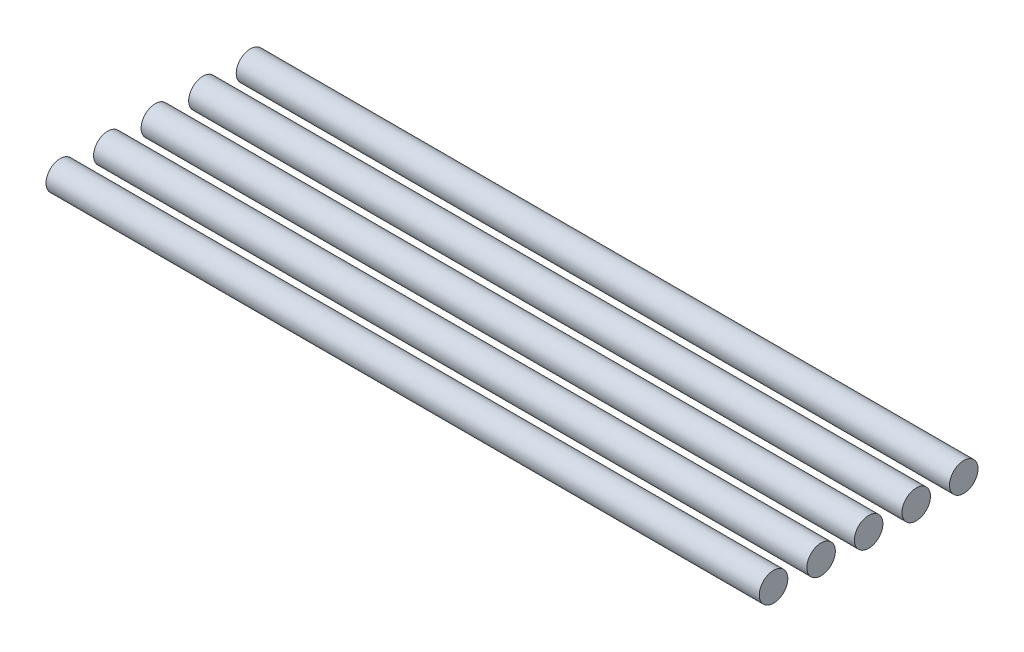
ISO-10303-21;
HEADER;
FILE_DESCRIPTION(('STEP AP214'),'2;1');
FILE_NAME('part.step','',(''),(''),'','','');
FILE_SCHEMA(('AUTOMOTIVE_DESIGN { 1 0 10303 214 1 1 1 1 }'));
ENDSEC;
DATA;
#1=APPLICATION_CONTEXT('core data for automotive mechanical design processes');
#2=APPLICATION_PROTOCOL_DEFINITION('international standard','automotive_design',2000,#1);
#3=PRODUCT_CONTEXT('',#1,'mechanical');
#4=PRODUCT('Part','Part','',(#3));
#5=PRODUCT_RELATED_PRODUCT_CATEGORY('part','',(#4));
#6=PRODUCT_DEFINITION_FORMATION('','',#4);
#7=PRODUCT_DEFINITION_CONTEXT('part definition',#1,'design');
#8=PRODUCT_DEFINITION('design','',#6,#7);
#9=PRODUCT_DEFINITION_SHAPE('','',#8);
#10=(LENGTH_UNIT() NAMED_UNIT(*) SI_UNIT(.MILLI.,.METRE.));
#11=(NAMED_UNIT(*) PLANE_ANGLE_UNIT() SI_UNIT($,.RADIAN.));
#12=(NAMED_UNIT(*) SI_UNIT($,.STERADIAN.) SOLID_ANGLE_UNIT());
#13=UNCERTAINTY_MEASURE_WITH_UNIT(LENGTH_MEASURE(1.E-05),#10,'distance_accuracy_value','');
#14=(GEOMETRIC_REPRESENTATION_CONTEXT(3) GLOBAL_UNCERTAINTY_ASSIGNED_CONTEXT((#13)) GLOBAL_UNIT_ASSIGNED_CONTEXT((#10,
#11,#12)) REPRESENTATION_CONTEXT('',''));
#15=CARTESIAN_POINT('',(0.,0.,0.));
#16=DIRECTION('',(0.,0.,1.));
#17=DIRECTION('',(1.,0.,0.));
#18=AXIS2_PLACEMENT_3D('',#15,#16,#17);
#19=CARTESIAN_POINT('',(19.05,0.,-5.08));
#20=DIRECTION('',(-1.,0.,0.));
#21=DIRECTION('',(0.,0.,1.));
#22=AXIS2_PLACEMENT_3D('',#19,#20,#21);
#23=CYLINDRICAL_SURFACE('',#22,0.761999999999999);
#24=CARTESIAN_POINT('',(19.05,0.,-5.08));
#25=DIRECTION('',(1.,0.,0.));
#26=DIRECTION('',(0.,0.,-1.));
#27=AXIS2_PLACEMENT_3D('',#24,#25,#26);
#28=CIRCLE('',#27,0.761999999999999);
#29=CARTESIAN_POINT('',(19.05,0.,-4.318));
#30=VERTEX_POINT('',#29);
#31=EDGE_CURVE('E11',#30,#30,#28,.T.);
#32=CARTESIAN_POINT('',(-19.05,0.,-5.08));
#33=DIRECTION('',(1.,0.,0.));
#34=DIRECTION('',(0.,0.,-1.));
#35=AXIS2_PLACEMENT_3D('',#32,#33,#34);
#36=CIRCLE('',#35,0.761999999999999);
#37=CARTESIAN_POINT('',(-19.05,0.,-4.318));
#38=VERTEX_POINT('',#37);
#39=EDGE_CURVE('E45',#38,#38,#36,.T.);
#40=CARTESIAN_POINT('',(19.05,0.,-4.318));
#41=CARTESIAN_POINT('',(18.653125,0.,-4.318));
#42=CARTESIAN_POINT('',(18.25625,0.,-4.318));
#43=CARTESIAN_POINT('',(17.4625,0.,-4.318));
#44=CARTESIAN_POINT('',(17.065625,0.,-4.318));
#45=CARTESIAN_POINT('',(16.271875,0.,-4.318));
#46=CARTESIAN_POINT('',(15.875,0.,-4.318));
#47=CARTESIAN_POINT('',(15.08125,0.,-4.318));
#48=CARTESIAN_POINT('',(14.684375,0.,-4.318));
#49=CARTESIAN_POINT('',(13.890625,0.,-4.318));
#50=CARTESIAN_POINT('',(13.49375,0.,-4.318));
#51=CARTESIAN_POINT('',(12.7,0.,-4.318));
#52=CARTESIAN_POINT('',(12.303125,0.,-4.318));
#53=CARTESIAN_POINT('',(11.509375,0.,-4.318));
#54=CARTESIAN_POINT('',(11.1125,0.,-4.318));
#55=CARTESIAN_POINT('',(10.31875,0.,-4.318));
#56=CARTESIAN_POINT('',(9.921875,0.,-4.318));
#57=CARTESIAN_POINT('',(9.128125,0.,-4.318));
#58=CARTESIAN_POINT('',(8.73125,0.,-4.318));
#59=CARTESIAN_POINT('',(7.9375,0.,-4.318));
#60=CARTESIAN_POINT('',(7.540625,0.,-4.318));
#61=CARTESIAN_POINT('',(6.746875,0.,-4.318));
#62=CARTESIAN_POINT('',(6.35,0.,-4.318));
#63=CARTESIAN_POINT('',(5.55625,0.,-4.318));
#64=CARTESIAN_POINT('',(5.159375,0.,-4.318));
#65=CARTESIAN_POINT('',(4.365625,0.,-4.318));
#66=CARTESIAN_POINT('',(3.96875,0.,-4.318));
#67=CARTESIAN_POINT('',(3.175,0.,-4.318));
#68=CARTESIAN_POINT('',(2.778125,0.,-4.318));
#69=CARTESIAN_POINT('',(1.984375,0.,-4.318));
#70=CARTESIAN_POINT('',(1.5875,0.,-4.318));
#71=CARTESIAN_POINT('',(0.79375,0.,-4.318));
#72=CARTESIAN_POINT('',(0.396875,0.,-4.318));
#73=CARTESIAN_POINT('',(-0.396875,0.,-4.318));
#74=CARTESIAN_POINT('',(-0.79375,0.,-4.318));
#75=CARTESIAN_POINT('',(-1.5875,0.,-4.318));
#76=CARTESIAN_POINT('',(-1.984375,0.,-4.318));
#77=CARTESIAN_POINT('',(-2.778125,0.,-4.318));
#78=CARTESIAN_POINT('',(-3.175,0.,-4.318));
#79=CARTESIAN_POINT('',(-3.96875,0.,-4.318));
#80=CARTESIAN_POINT('',(-4.365625,0.,-4.318));
#81=CARTESIAN_POINT('',(-5.159375,0.,-4.318));
#82=CARTESIAN_POINT('',(-5.55625,0.,-4.318));
#83=CARTESIAN_POINT('',(-6.35,0.,-4.318));
#84=CARTESIAN_POINT('',(-6.746875,0.,-4.318));
#85=CARTESIAN_POINT('',(-7.540625,0.,-4.318));
#86=CARTESIAN_POINT('',(-7.9375,0.,-4.318));
#87=CARTESIAN_POINT('',(-8.73125,0.,-4.318));
#88=CARTESIAN_POINT('',(-9.128125,0.,-4.318));
#89=CARTESIAN_POINT('',(-9.921875,0.,-4.318));
#90=CARTESIAN_POINT('',(-10.31875,0.,-4.318));
#91=CARTESIAN_POINT('',(-11.1125,0.,-4.318));
#92=CARTESIAN_POINT('',(-11.509375,0.,-4.318));
#93=CARTESIAN_POINT('',(-12.303125,0.,-4.318));
#94=CARTESIAN_POINT('',(-12.7,0.,-4.318));
#95=CARTESIAN_POINT('',(-13.49375,0.,-4.318));
#96=CARTESIAN_POINT('',(-13.890625,0.,-4.318));
#97=CARTESIAN_POINT('',(-14.684375,0.,-4.318));
#98=CARTESIAN_POINT('',(-15.08125,0.,-4.318));
#99=CARTESIAN_POINT('',(-15.875,0.,-4.318));
#100=CARTESIAN_POINT('',(-16.271875,0.,-4.318));
#101=CARTESIAN_POINT('',(-17.065625,0.,-4.318));
#102=CARTESIAN_POINT('',(-17.4625,0.,-4.318));
#103=CARTESIAN_POINT('',(-18.25625,0.,-4.318));
#104=CARTESIAN_POINT('',(-18.653125,0.,-4.318));
#105=CARTESIAN_POINT('',(-19.05,0.,-4.318));
#106=B_SPLINE_CURVE_WITH_KNOTS('',3,(#40,#41,#42,#43,#44,#45,#46,#47,#48,#49,#50,#51,#52,#53,
#54,#55,#56,#57,#58,#59,#60,#61,#62,#63,#64,#65,#66,#67,#68,#69,#70,#71,#72,#73,#74,#75,#76,#77,
#78,#79,#80,#81,#82,#83,#84,#85,#86,#87,#88,#89,#90,#91,#92,#93,#94,#95,#96,#97,#98,#99,#100,
#101,#102,#103,#104,#105),.UNSPECIFIED.,.F.,.F.,(4,2,2,2,2,2,2,2,2,2,2,2,2,2,2,2,2,2,2,2,2,2,2,
2,2,2,2,2,2,2,2,2,4),(0.,1.190625,2.38125,3.571875,4.7625,5.953125,7.14375,8.334375,9.525,
10.715625,11.90625,13.096875,14.2875,15.478125,16.66875,17.859375,19.05,20.240625,21.43125,
22.621875,23.8125,25.003125,26.19375,27.384375,28.575,29.765625,30.95625,32.146875,33.3375,
34.528125,35.71875,36.909375,38.1),.UNSPECIFIED.);
#107=EDGE_CURVE('BSEAM42',#30,#38,#106,.T.);
#108=ORIENTED_EDGE('',*,*,#31,.F.);
#109=ORIENTED_EDGE('',*,*,#39,.T.);
#110=ORIENTED_EDGE('',*,*,#107,.T.);
#111=ORIENTED_EDGE('',*,*,#107,.F.);
#112=EDGE_LOOP('',(#108,#110,#109,#111));
#113=FACE_BOUND('',#112,.T.);
#114=ADVANCED_FACE('F42',(#113),#23,.T.);
#115=CARTESIAN_POINT('',(19.05,0.,-5.08));
#116=DIRECTION('',(1.,0.,0.));
#117=DIRECTION('',(0.,0.,-1.));
#118=AXIS2_PLACEMENT_3D('',#115,#116,#117);
#119=PLANE('',#118);
#120=ORIENTED_EDGE('',*,*,#31,.T.);
#121=EDGE_LOOP('',(#120));
#122=FACE_BOUND('',#121,.T.);
#123=ADVANCED_FACE('F57',(#122),#119,.T.);
#124=CARTESIAN_POINT('',(-19.05,0.,-5.08));
#125=DIRECTION('',(1.,0.,0.));
#126=DIRECTION('',(0.,0.,-1.));
#127=AXIS2_PLACEMENT_3D('',#124,#125,#126);
#128=PLANE('',#127);
#129=ORIENTED_EDGE('',*,*,#39,.F.);
#130=EDGE_LOOP('',(#129));
#131=FACE_BOUND('',#130,.T.);
#132=ADVANCED_FACE('F55',(#131),#128,.F.);
#133=CLOSED_SHELL('',(#114,#123,#132));
#134=MANIFOLD_SOLID_BREP('B2',#133);
#135=CARTESIAN_POINT('',(19.05,0.,-2.54));
#136=DIRECTION('',(-1.,0.,0.));
#137=DIRECTION('',(0.,0.,1.));
#138=AXIS2_PLACEMENT_3D('',#135,#136,#137);
#139=CYLINDRICAL_SURFACE('',#138,0.762);
#140=CARTESIAN_POINT('',(19.05,0.,-2.54));
#141=DIRECTION('',(1.,0.,0.));
#142=DIRECTION('',(0.,0.,-1.));
#143=AXIS2_PLACEMENT_3D('',#140,#141,#142);
#144=CIRCLE('',#143,0.762);
#145=CARTESIAN_POINT('',(19.05,0.,-1.778));
#146=VERTEX_POINT('',#145);
#147=EDGE_CURVE('E41',#146,#146,#144,.T.);
#148=CARTESIAN_POINT('',(-19.05,0.,-2.54));
#149=DIRECTION('',(1.,0.,0.));
#150=DIRECTION('',(0.,0.,-1.));
#151=AXIS2_PLACEMENT_3D('',#148,#149,#150);
#152=CIRCLE('',#151,0.762);
#153=CARTESIAN_POINT('',(-19.05,0.,-1.778));
#154=VERTEX_POINT('',#153);
#155=EDGE_CURVE('E94',#154,#154,#152,.T.);
#156=CARTESIAN_POINT('',(19.05,0.,-1.778));
#157=CARTESIAN_POINT('',(18.653125,0.,-1.778));
#158=CARTESIAN_POINT('',(18.25625,0.,-1.778));
#159=CARTESIAN_POINT('',(17.4625,0.,-1.778));
#160=CARTESIAN_POINT('',(17.065625,0.,-1.778));
#161=CARTESIAN_POINT('',(16.271875,0.,-1.778));
#162=CARTESIAN_POINT('',(15.875,0.,-1.778));
#163=CARTESIAN_POINT('',(15.08125,0.,-1.778));
#164=CARTESIAN_POINT('',(14.684375,0.,-1.778));
#165=CARTESIAN_POINT('',(13.890625,0.,-1.778));
#166=CARTESIAN_POINT('',(13.49375,0.,-1.778));
#167=CARTESIAN_POINT('',(12.7,0.,-1.778));
#168=CARTESIAN_POINT('',(12.303125,0.,-1.778));
#169=CARTESIAN_POINT('',(11.509375,0.,-1.778));
#170=CARTESIAN_POINT('',(11.1125,0.,-1.778));
#171=CARTESIAN_POINT('',(10.31875,0.,-1.778));
#172=CARTESIAN_POINT('',(9.921875,0.,-1.778));
#173=CARTESIAN_POINT('',(9.128125,0.,-1.778));
#174=CARTESIAN_POINT('',(8.73125,0.,-1.778));
#175=CARTESIAN_POINT('',(7.9375,0.,-1.778));
#176=CARTESIAN_POINT('',(7.540625,0.,-1.778));
#177=CARTESIAN_POINT('',(6.746875,0.,-1.778));
#178=CARTESIAN_POINT('',(6.35,0.,-1.778));
#179=CARTESIAN_POINT('',(5.55625,0.,-1.778));
#180=CARTESIAN_POINT('',(5.159375,0.,-1.778));
#181=CARTESIAN_POINT('',(4.365625,0.,-1.778));
#182=CARTESIAN_POINT('',(3.96875,0.,-1.778));
#183=CARTESIAN_POINT('',(3.175,0.,-1.778));
#184=CARTESIAN_POINT('',(2.778125,0.,-1.778));
#185=CARTESIAN_POINT('',(1.984375,0.,-1.778));
#186=CARTESIAN_POINT('',(1.5875,0.,-1.778));
#187=CARTESIAN_POINT('',(0.79375,0.,-1.778));
#188=CARTESIAN_POINT('',(0.396875,0.,-1.778));
#189=CARTESIAN_POINT('',(-0.396875,0.,-1.778));
#190=CARTESIAN_POINT('',(-0.79375,0.,-1.778));
#191=CARTESIAN_POINT('',(-1.5875,0.,-1.778));
#192=CARTESIAN_POINT('',(-1.984375,0.,-1.778));
#193=CARTESIAN_POINT('',(-2.778125,0.,-1.778));
#194=CARTESIAN_POINT('',(-3.175,0.,-1.778));
#195=CARTESIAN_POINT('',(-3.96875,0.,-1.778));
#196=CARTESIAN_POINT('',(-4.365625,0.,-1.778));
#197=CARTESIAN_POINT('',(-5.159375,0.,-1.778));
#198=CARTESIAN_POINT('',(-5.55625,0.,-1.778));
#199=CARTESIAN_POINT('',(-6.35,0.,-1.778));
#200=CARTESIAN_POINT('',(-6.746875,0.,-1.778));
#201=CARTESIAN_POINT('',(-7.540625,0.,-1.778));
#202=CARTESIAN_POINT('',(-7.9375,0.,-1.778));
#203=CARTESIAN_POINT('',(-8.73125,0.,-1.778));
#204=CARTESIAN_POINT('',(-9.128125,0.,-1.778));
#205=CARTESIAN_POINT('',(-9.921875,0.,-1.778));
#206=CARTESIAN_POINT('',(-10.31875,0.,-1.778));
#207=CARTESIAN_POINT('',(-11.1125,0.,-1.778));
#208=CARTESIAN_POINT('',(-11.509375,0.,-1.778));
#209=CARTESIAN_POINT('',(-12.303125,0.,-1.778));
#210=CARTESIAN_POINT('',(-12.7,0.,-1.778));
#211=CARTESIAN_POINT('',(-13.49375,0.,-1.778));
#212=CARTESIAN_POINT('',(-13.890625,0.,-1.778));
#213=CARTESIAN_POINT('',(-14.684375,0.,-1.778));
#214=CARTESIAN_POINT('',(-15.08125,0.,-1.778));
#215=CARTESIAN_POINT('',(-15.875,0.,-1.778));
#216=CARTESIAN_POINT('',(-16.271875,0.,-1.778));
#217=CARTESIAN_POINT('',(-17.065625,0.,-1.778));
#218=CARTESIAN_POINT('',(-17.4625,0.,-1.778));
#219=CARTESIAN_POINT('',(-18.25625,0.,-1.778));
#220=CARTESIAN_POINT('',(-18.653125,0.,-1.778));
#221=CARTESIAN_POINT('',(-19.05,0.,-1.778));
#222=B_SPLINE_CURVE_WITH_KNOTS('',3,(#156,#157,#158,#159,#160,#161,#162,#163,#164,#165,#166,
#167,#168,#169,#170,#171,#172,#173,#174,#175,#176,#177,#178,#179,#180,#181,#182,#183,#184,#185,
#186,#187,#188,#189,#190,#191,#192,#193,#194,#195,#196,#197,#198,#199,#200,#201,#202,#203,#204,
#205,#206,#207,#208,#209,#210,#211,#212,#213,#214,#215,#216,#217,#218,#219,#220,#221),
.UNSPECIFIED.,.F.,.F.,(4,2,2,2,2,2,2,2,2,2,2,2,2,2,2,2,2,2,2,2,2,2,2,2,2,2,2,2,2,2,2,2,4),(0.,
1.190625,2.38125,3.571875,4.7625,5.953125,7.14375,8.334375,9.525,10.715625,11.90625,13.096875,
14.2875,15.478125,16.66875,17.859375,19.05,20.240625,21.43125,22.621875,23.8125,25.003125,
26.19375,27.384375,28.575,29.765625,30.95625,32.146875,33.3375,34.528125,35.71875,36.909375,
38.1),.UNSPECIFIED.);
#223=EDGE_CURVE('BSEAM91',#146,#154,#222,.T.);
#224=ORIENTED_EDGE('',*,*,#147,.F.);
#225=ORIENTED_EDGE('',*,*,#155,.T.);
#226=ORIENTED_EDGE('',*,*,#223,.T.);
#227=ORIENTED_EDGE('',*,*,#223,.F.);
#228=EDGE_LOOP('',(#224,#226,#225,#227));
#229=FACE_BOUND('',#228,.T.);
#230=ADVANCED_FACE('F91',(#229),#139,.T.);
#231=CARTESIAN_POINT('',(19.05,0.,-2.54));
#232=DIRECTION('',(1.,0.,0.));
#233=DIRECTION('',(0.,0.,-1.));
#234=AXIS2_PLACEMENT_3D('',#231,#232,#233);
#235=PLANE('',#234);
#236=ORIENTED_EDGE('',*,*,#147,.T.);
#237=EDGE_LOOP('',(#236));
#238=FACE_BOUND('',#237,.T.);
#239=ADVANCED_FACE('F106',(#238),#235,.T.);
#240=CARTESIAN_POINT('',(-19.05,0.,-2.54));
#241=DIRECTION('',(1.,0.,0.));
#242=DIRECTION('',(0.,0.,-1.));
#243=AXIS2_PLACEMENT_3D('',#240,#241,#242);
#244=PLANE('',#243);
#245=ORIENTED_EDGE('',*,*,#155,.F.);
#246=EDGE_LOOP('',(#245));
#247=FACE_BOUND('',#246,.T.);
#248=ADVANCED_FACE('F104',(#247),#244,.F.);
#249=CLOSED_SHELL('',(#230,#239,#248));
#250=MANIFOLD_SOLID_BREP('B6',#249);
#251=CARTESIAN_POINT('',(19.05,0.,2.54));
#252=DIRECTION('',(-1.,0.,0.));
#253=DIRECTION('',(0.,0.,1.));
#254=AXIS2_PLACEMENT_3D('',#251,#252,#253);
#255=CYLINDRICAL_SURFACE('',#254,0.762);
#256=CARTESIAN_POINT('',(19.05,0.,2.54));
#257=DIRECTION('',(1.,0.,0.));
#258=DIRECTION('',(0.,0.,-1.));
#259=AXIS2_PLACEMENT_3D('',#256,#257,#258);
#260=CIRCLE('',#259,0.762);
#261=CARTESIAN_POINT('',(19.05,0.,3.302));
#262=VERTEX_POINT('',#261);
#263=EDGE_CURVE('E90',#262,#262,#260,.T.);
#264=CARTESIAN_POINT('',(-19.05,0.,2.54));
#265=DIRECTION('',(1.,0.,0.));
#266=DIRECTION('',(0.,0.,-1.));
#267=AXIS2_PLACEMENT_3D('',#264,#265,#266);
#268=CIRCLE('',#267,0.762);
#269=CARTESIAN_POINT('',(-19.05,0.,3.302));
#270=VERTEX_POINT('',#269);
#271=EDGE_CURVE('E143',#270,#270,#268,.T.);
#272=CARTESIAN_POINT('',(19.05,0.,3.302));
#273=CARTESIAN_POINT('',(18.653125,0.,3.302));
#274=CARTESIAN_POINT('',(18.25625,0.,3.302));
#275=CARTESIAN_POINT('',(17.4625,0.,3.302));
#276=CARTESIAN_POINT('',(17.065625,0.,3.302));
#277=CARTESIAN_POINT('',(16.271875,0.,3.302));
#278=CARTESIAN_POINT('',(15.875,0.,3.302));
#279=CARTESIAN_POINT('',(15.08125,0.,3.302));
#280=CARTESIAN_POINT('',(14.684375,0.,3.302));
#281=CARTESIAN_POINT('',(13.890625,0.,3.302));
#282=CARTESIAN_POINT('',(13.49375,0.,3.302));
#283=CARTESIAN_POINT('',(12.7,0.,3.302));
#284=CARTESIAN_POINT('',(12.303125,0.,3.302));
#285=CARTESIAN_POINT('',(11.509375,0.,3.302));
#286=CARTESIAN_POINT('',(11.1125,0.,3.302));
#287=CARTESIAN_POINT('',(10.31875,0.,3.302));
#288=CARTESIAN_POINT('',(9.921875,0.,3.302));
#289=CARTESIAN_POINT('',(9.128125,0.,3.302));
#290=CARTESIAN_POINT('',(8.73125,0.,3.302));
#291=CARTESIAN_POINT('',(7.9375,0.,3.302));
#292=CARTESIAN_POINT('',(7.540625,0.,3.302));
#293=CARTESIAN_POINT('',(6.746875,0.,3.302));
#294=CARTESIAN_POINT('',(6.35,0.,3.302));
#295=CARTESIAN_POINT('',(5.55625,0.,3.302));
#296=CARTESIAN_POINT('',(5.159375,0.,3.302));
#297=CARTESIAN_POINT('',(4.365625,0.,3.302));
#298=CARTESIAN_POINT('',(3.96875,0.,3.302));
#299=CARTESIAN_POINT('',(3.175,0.,3.302));
#300=CARTESIAN_POINT('',(2.778125,0.,3.302));
#301=CARTESIAN_POINT('',(1.984375,0.,3.302));
#302=CARTESIAN_POINT('',(1.5875,0.,3.302));
#303=CARTESIAN_POINT('',(0.79375,0.,3.302));
#304=CARTESIAN_POINT('',(0.396875,0.,3.302));
#305=CARTESIAN_POINT('',(-0.396875,0.,3.302));
#306=CARTESIAN_POINT('',(-0.79375,0.,3.302));
#307=CARTESIAN_POINT('',(-1.5875,0.,3.302));
#308=CARTESIAN_POINT('',(-1.984375,0.,3.302));
#309=CARTESIAN_POINT('',(-2.778125,0.,3.302));
#310=CARTESIAN_POINT('',(-3.175,0.,3.302));
#311=CARTESIAN_POINT('',(-3.96875,0.,3.302));
#312=CARTESIAN_POINT('',(-4.365625,0.,3.302));
#313=CARTESIAN_POINT('',(-5.159375,0.,3.302));
#314=CARTESIAN_POINT('',(-5.55625,0.,3.302));
#315=CARTESIAN_POINT('',(-6.35,0.,3.302));
#316=CARTESIAN_POINT('',(-6.746875,0.,3.302));
#317=CARTESIAN_POINT('',(-7.540625,0.,3.302));
#318=CARTESIAN_POINT('',(-7.9375,0.,3.302));
#319=CARTESIAN_POINT('',(-8.73125,0.,3.302));
#320=CARTESIAN_POINT('',(-9.128125,0.,3.302));
#321=CARTESIAN_POINT('',(-9.921875,0.,3.302));
#322=CARTESIAN_POINT('',(-10.31875,0.,3.302));
#323=CARTESIAN_POINT('',(-11.1125,0.,3.302));
#324=CARTESIAN_POINT('',(-11.509375,0.,3.302));
#325=CARTESIAN_POINT('',(-12.303125,0.,3.302));
#326=CARTESIAN_POINT('',(-12.7,0.,3.302));
#327=CARTESIAN_POINT('',(-13.49375,0.,3.302));
#328=CARTESIAN_POINT('',(-13.890625,0.,3.302));
#329=CARTESIAN_POINT('',(-14.684375,0.,3.302));
#330=CARTESIAN_POINT('',(-15.08125,0.,3.302));
#331=CARTESIAN_POINT('',(-15.875,0.,3.302));
#332=CARTESIAN_POINT('',(-16.271875,0.,3.302));
#333=CARTESIAN_POINT('',(-17.065625,0.,3.302));
#334=CARTESIAN_POINT('',(-17.4625,0.,3.302));
#335=CARTESIAN_POINT('',(-18.25625,0.,3.302));
#336=CARTESIAN_POINT('',(-18.653125,0.,3.302));
#337=CARTESIAN_POINT('',(-19.05,0.,3.302));
#338=B_SPLINE_CURVE_WITH_KNOTS('',3,(#272,#273,#274,#275,#276,#277,#278,#279,#280,#281,#282,
#283,#284,#285,#286,#287,#288,#289,#290,#291,#292,#293,#294,#295,#296,#297,#298,#299,#300,#301,
#302,#303,#304,#305,#306,#307,#308,#309,#310,#311,#312,#313,#314,#315,#316,#317,#318,#319,#320,
#321,#322,#323,#324,#325,#326,#327,#328,#329,#330,#331,#332,#333,#334,#335,#336,#337),
.UNSPECIFIED.,.F.,.F.,(4,2,2,2,2,2,2,2,2,2,2,2,2,2,2,2,2,2,2,2,2,2,2,2,2,2,2,2,2,2,2,2,4),(0.,
1.190625,2.38125,3.571875,4.7625,5.953125,7.14375,8.334375,9.525,10.715625,11.90625,13.096875,
14.2875,15.478125,16.66875,17.859375,19.05,20.240625,21.43125,22.621875,23.8125,25.003125,
26.19375,27.384375,28.575,29.765625,30.95625,32.146875,33.3375,34.528125,35.71875,36.909375,
38.1),.UNSPECIFIED.);
#339=EDGE_CURVE('BSEAM140',#262,#270,#338,.T.);
#340=ORIENTED_EDGE('',*,*,#263,.F.);
#341=ORIENTED_EDGE('',*,*,#271,.T.);
#342=ORIENTED_EDGE('',*,*,#339,.T.);
#343=ORIENTED_EDGE('',*,*,#339,.F.);
#344=EDGE_LOOP('',(#340,#342,#341,#343));
#345=FACE_BOUND('',#344,.T.);
#346=ADVANCED_FACE('F140',(#345),#255,.T.);
#347=CARTESIAN_POINT('',(19.05,0.,2.54));
#348=DIRECTION('',(1.,0.,0.));
#349=DIRECTION('',(0.,0.,-1.));
#350=AXIS2_PLACEMENT_3D('',#347,#348,#349);
#351=PLANE('',#350);
#352=ORIENTED_EDGE('',*,*,#263,.T.);
#353=EDGE_LOOP('',(#352));
#354=FACE_BOUND('',#353,.T.);
#355=ADVANCED_FACE('F155',(#354),#351,.T.);
#356=CARTESIAN_POINT('',(-19.05,0.,2.54));
#357=DIRECTION('',(1.,0.,0.));
#358=DIRECTION('',(0.,0.,-1.));
#359=AXIS2_PLACEMENT_3D('',#356,#357,#358);
#360=PLANE('',#359);
#361=ORIENTED_EDGE('',*,*,#271,.F.);
#362=EDGE_LOOP('',(#361));
#363=FACE_BOUND('',#362,.T.);
#364=ADVANCED_FACE('F153',(#363),#360,.F.);
#365=CLOSED_SHELL('',(#346,#355,#364));
#366=MANIFOLD_SOLID_BREP('B36',#365);
#367=CARTESIAN_POINT('',(19.05,0.,5.08));
#368=DIRECTION('',(-1.,0.,0.));
#369=DIRECTION('',(0.,0.,1.));
#370=AXIS2_PLACEMENT_3D('',#367,#368,#369);
#371=CYLINDRICAL_SURFACE('',#370,0.761999999999999);
#372=CARTESIAN_POINT('',(19.05,0.,5.08));
#373=DIRECTION('',(1.,0.,0.));
#374=DIRECTION('',(0.,0.,-1.));
#375=AXIS2_PLACEMENT_3D('',#372,#373,#374);
#376=CIRCLE('',#375,0.761999999999999);
#377=CARTESIAN_POINT('',(19.05,0.,5.842));
#378=VERTEX_POINT('',#377);
#379=EDGE_CURVE('E139',#378,#378,#376,.T.);
#380=CARTESIAN_POINT('',(-19.05,0.,5.08));
#381=DIRECTION('',(1.,0.,0.));
#382=DIRECTION('',(0.,0.,-1.));
#383=AXIS2_PLACEMENT_3D('',#380,#381,#382);
#384=CIRCLE('',#383,0.761999999999999);
#385=CARTESIAN_POINT('',(-19.05,0.,5.842));
#386=VERTEX_POINT('',#385);
#387=EDGE_CURVE('E191',#386,#386,#384,.T.);
#388=CARTESIAN_POINT('',(19.05,0.,5.842));
#389=CARTESIAN_POINT('',(18.653125,0.,5.842));
#390=CARTESIAN_POINT('',(18.25625,0.,5.842));
#391=CARTESIAN_POINT('',(17.4625,0.,5.842));
#392=CARTESIAN_POINT('',(17.065625,0.,5.842));
#393=CARTESIAN_POINT('',(16.271875,0.,5.842));
#394=CARTESIAN_POINT('',(15.875,0.,5.842));
#395=CARTESIAN_POINT('',(15.08125,0.,5.842));
#396=CARTESIAN_POINT('',(14.684375,0.,5.842));
#397=CARTESIAN_POINT('',(13.890625,0.,5.842));
#398=CARTESIAN_POINT('',(13.49375,0.,5.842));
#399=CARTESIAN_POINT('',(12.7,0.,5.842));
#400=CARTESIAN_POINT('',(12.303125,0.,5.842));
#401=CARTESIAN_POINT('',(11.509375,0.,5.842));
#402=CARTESIAN_POINT('',(11.1125,0.,5.842));
#403=CARTESIAN_POINT('',(10.31875,0.,5.842));
#404=CARTESIAN_POINT('',(9.921875,0.,5.842));
#405=CARTESIAN_POINT('',(9.128125,0.,5.842));
#406=CARTESIAN_POINT('',(8.73125,0.,5.842));
#407=CARTESIAN_POINT('',(7.9375,0.,5.842));
#408=CARTESIAN_POINT('',(7.540625,0.,5.842));
#409=CARTESIAN_POINT('',(6.746875,0.,5.842));
#410=CARTESIAN_POINT('',(6.35,0.,5.842));
#411=CARTESIAN_POINT('',(5.55625,0.,5.842));
#412=CARTESIAN_POINT('',(5.159375,0.,5.842));
#413=CARTESIAN_POINT('',(4.365625,0.,5.842));
#414=CARTESIAN_POINT('',(3.96875,0.,5.842));
#415=CARTESIAN_POINT('',(3.175,0.,5.842));
#416=CARTESIAN_POINT('',(2.778125,0.,5.842));
#417=CARTESIAN_POINT('',(1.984375,0.,5.842));
#418=CARTESIAN_POINT('',(1.5875,0.,5.842));
#419=CARTESIAN_POINT('',(0.79375,0.,5.842));
#420=CARTESIAN_POINT('',(0.396875,0.,5.842));
#421=CARTESIAN_POINT('',(-0.396875,0.,5.842));
#422=CARTESIAN_POINT('',(-0.79375,0.,5.842));
#423=CARTESIAN_POINT('',(-1.5875,0.,5.842));
#424=CARTESIAN_POINT('',(-1.984375,0.,5.842));
#425=CARTESIAN_POINT('',(-2.778125,0.,5.842));
#426=CARTESIAN_POINT('',(-3.175,0.,5.842));
#427=CARTESIAN_POINT('',(-3.96875,0.,5.842));
#428=CARTESIAN_POINT('',(-4.365625,0.,5.842));
#429=CARTESIAN_POINT('',(-5.159375,0.,5.842));
#430=CARTESIAN_POINT('',(-5.55625,0.,5.842));
#431=CARTESIAN_POINT('',(-6.35,0.,5.842));
#432=CARTESIAN_POINT('',(-6.746875,0.,5.842));
#433=CARTESIAN_POINT('',(-7.540625,0.,5.842));
#434=CARTESIAN_POINT('',(-7.9375,0.,5.842));
#435=CARTESIAN_POINT('',(-8.73125,0.,5.842));
#436=CARTESIAN_POINT('',(-9.128125,0.,5.842));
#437=CARTESIAN_POINT('',(-9.921875,0.,5.842));
#438=CARTESIAN_POINT('',(-10.31875,0.,5.842));
#439=CARTESIAN_POINT('',(-11.1125,0.,5.842));
#440=CARTESIAN_POINT('',(-11.509375,0.,5.842));
#441=CARTESIAN_POINT('',(-12.303125,0.,5.842));
#442=CARTESIAN_POINT('',(-12.7,0.,5.842));
#443=CARTESIAN_POINT('',(-13.49375,0.,5.842));
#444=CARTESIAN_POINT('',(-13.890625,0.,5.842));
#445=CARTESIAN_POINT('',(-14.684375,0.,5.842));
#446=CARTESIAN_POINT('',(-15.08125,0.,5.842));
#447=CARTESIAN_POINT('',(-15.875,0.,5.842));
#448=CARTESIAN_POINT('',(-16.271875,0.,5.842));
#449=CARTESIAN_POINT('',(-17.065625,0.,5.842));
#450=CARTESIAN_POINT('',(-17.4625,0.,5.842));
#451=CARTESIAN_POINT('',(-18.25625,0.,5.842));
#452=CARTESIAN_POINT('',(-18.653125,0.,5.842));
#453=CARTESIAN_POINT('',(-19.05,0.,5.842));
#454=B_SPLINE_CURVE_WITH_KNOTS('',3,(#388,#389,#390,#391,#392,#393,#394,#395,#396,#397,#398,
#399,#400,#401,#402,#403,#404,#405,#406,#407,#408,#409,#410,#411,#412,#413,#414,#415,#416,#417,
#418,#419,#420,#421,#422,#423,#424,#425,#426,#427,#428,#429,#430,#431,#432,#433,#434,#435,#436,
#437,#438,#439,#440,#441,#442,#443,#444,#445,#446,#447,#448,#449,#450,#451,#452,#453),
.UNSPECIFIED.,.F.,.F.,(4,2,2,2,2,2,2,2,2,2,2,2,2,2,2,2,2,2,2,2,2,2,2,2,2,2,2,2,2,2,2,2,4),(0.,
1.190625,2.38125,3.571875,4.7625,5.953125,7.14375,8.334375,9.525,10.715625,11.90625,13.096875,
14.2875,15.478125,16.66875,17.859375,19.05,20.240625,21.43125,22.621875,23.8125,25.003125,
26.19375,27.384375,28.575,29.765625,30.95625,32.146875,33.3375,34.528125,35.71875,36.909375,
38.1),.UNSPECIFIED.);
#455=EDGE_CURVE('BSEAM188',#378,#386,#454,.T.);
#456=ORIENTED_EDGE('',*,*,#379,.F.);
#457=ORIENTED_EDGE('',*,*,#387,.T.);
#458=ORIENTED_EDGE('',*,*,#455,.T.);
#459=ORIENTED_EDGE('',*,*,#455,.F.);
#460=EDGE_LOOP('',(#456,#458,#457,#459));
#461=FACE_BOUND('',#460,.T.);
#462=ADVANCED_FACE('F188',(#461),#371,.T.);
#463=CARTESIAN_POINT('',(19.05,0.,5.08));
#464=DIRECTION('',(1.,0.,0.));
#465=DIRECTION('',(0.,0.,-1.));
#466=AXIS2_PLACEMENT_3D('',#463,#464,#465);
#467=PLANE('',#466);
#468=ORIENTED_EDGE('',*,*,#379,.T.);
#469=EDGE_LOOP('',(#468));
#470=FACE_BOUND('',#469,.T.);
#471=ADVANCED_FACE('F203',(#470),#467,.T.);
#472=CARTESIAN_POINT('',(-19.05,0.,5.08));
#473=DIRECTION('',(1.,0.,0.));
#474=DIRECTION('',(0.,0.,-1.));
#475=AXIS2_PLACEMENT_3D('',#472,#473,#474);
#476=PLANE('',#475);
#477=ORIENTED_EDGE('',*,*,#387,.F.);
#478=EDGE_LOOP('',(#477));
#479=FACE_BOUND('',#478,.T.);
#480=ADVANCED_FACE('F201',(#479),#476,.F.);
#481=CLOSED_SHELL('',(#462,#471,#480));
#482=MANIFOLD_SOLID_BREP('B85',#481);
#483=CARTESIAN_POINT('',(19.05,0.,0.));
#484=DIRECTION('',(-1.,0.,0.));
#485=DIRECTION('',(0.,0.,1.));
#486=AXIS2_PLACEMENT_3D('',#483,#484,#485);
#487=CYLINDRICAL_SURFACE('',#486,0.762);
#488=CARTESIAN_POINT('',(19.05,0.,0.));
#489=DIRECTION('',(1.,0.,0.));
#490=DIRECTION('',(0.,0.,-1.));
#491=AXIS2_PLACEMENT_3D('',#488,#489,#490);
#492=CIRCLE('',#491,0.762);
#493=CARTESIAN_POINT('',(19.05,0.,0.762));
#494=VERTEX_POINT('',#493);
#495=EDGE_CURVE('E187',#494,#494,#492,.T.);
#496=CARTESIAN_POINT('',(-19.05,0.,0.));
#497=DIRECTION('',(1.,0.,0.));
#498=DIRECTION('',(0.,0.,-1.));
#499=AXIS2_PLACEMENT_3D('',#496,#497,#498);
#500=CIRCLE('',#499,0.762);
#501=CARTESIAN_POINT('',(-19.05,0.,0.762));
#502=VERTEX_POINT('',#501);
#503=EDGE_CURVE('E232',#502,#502,#500,.T.);
#504=CARTESIAN_POINT('',(19.05,0.,0.762));
#505=CARTESIAN_POINT('',(18.653125,0.,0.762));
#506=CARTESIAN_POINT('',(18.25625,0.,0.762));
#507=CARTESIAN_POINT('',(17.4625,0.,0.762));
#508=CARTESIAN_POINT('',(17.065625,0.,0.762));
#509=CARTESIAN_POINT('',(16.271875,0.,0.762));
#510=CARTESIAN_POINT('',(15.875,0.,0.762));
#511=CARTESIAN_POINT('',(15.08125,0.,0.762));
#512=CARTESIAN_POINT('',(14.684375,0.,0.762));
#513=CARTESIAN_POINT('',(13.890625,0.,0.762));
#514=CARTESIAN_POINT('',(13.49375,0.,0.762));
#515=CARTESIAN_POINT('',(12.7,0.,0.762));
#516=CARTESIAN_POINT('',(12.303125,0.,0.762));
#517=CARTESIAN_POINT('',(11.509375,0.,0.762));
#518=CARTESIAN_POINT('',(11.1125,0.,0.762));
#519=CARTESIAN_POINT('',(10.31875,0.,0.762));
#520=CARTESIAN_POINT('',(9.921875,0.,0.762));
#521=CARTESIAN_POINT('',(9.128125,0.,0.762));
#522=CARTESIAN_POINT('',(8.73125,0.,0.762));
#523=CARTESIAN_POINT('',(7.9375,0.,0.762));
#524=CARTESIAN_POINT('',(7.540625,0.,0.762));
#525=CARTESIAN_POINT('',(6.746875,0.,0.762));
#526=CARTESIAN_POINT('',(6.35,0.,0.762));
#527=CARTESIAN_POINT('',(5.55625,0.,0.762));
#528=CARTESIAN_POINT('',(5.159375,0.,0.762));
#529=CARTESIAN_POINT('',(4.365625,0.,0.762));
#530=CARTESIAN_POINT('',(3.96875,0.,0.762));
#531=CARTESIAN_POINT('',(3.175,0.,0.762));
#532=CARTESIAN_POINT('',(2.778125,0.,0.762));
#533=CARTESIAN_POINT('',(1.984375,0.,0.762));
#534=CARTESIAN_POINT('',(1.5875,0.,0.762));
#535=CARTESIAN_POINT('',(0.79375,0.,0.762));
#536=CARTESIAN_POINT('',(0.396875,0.,0.762));
#537=CARTESIAN_POINT('',(-0.396875,0.,0.762));
#538=CARTESIAN_POINT('',(-0.79375,0.,0.762));
#539=CARTESIAN_POINT('',(-1.5875,0.,0.762));
#540=CARTESIAN_POINT('',(-1.984375,0.,0.762));
#541=CARTESIAN_POINT('',(-2.778125,0.,0.762));
#542=CARTESIAN_POINT('',(-3.175,0.,0.762));
#543=CARTESIAN_POINT('',(-3.96875,0.,0.762));
#544=CARTESIAN_POINT('',(-4.365625,0.,0.762));
#545=CARTESIAN_POINT('',(-5.159375,0.,0.762));
#546=CARTESIAN_POINT('',(-5.55625,0.,0.762));
#547=CARTESIAN_POINT('',(-6.35,0.,0.762));
#548=CARTESIAN_POINT('',(-6.746875,0.,0.762));
#549=CARTESIAN_POINT('',(-7.540625,0.,0.762));
#550=CARTESIAN_POINT('',(-7.9375,0.,0.762));
#551=CARTESIAN_POINT('',(-8.73125,0.,0.762));
#552=CARTESIAN_POINT('',(-9.128125,0.,0.762));
#553=CARTESIAN_POINT('',(-9.921875,0.,0.762));
#554=CARTESIAN_POINT('',(-10.31875,0.,0.762));
#555=CARTESIAN_POINT('',(-11.1125,0.,0.762));
#556=CARTESIAN_POINT('',(-11.509375,0.,0.762));
#557=CARTESIAN_POINT('',(-12.303125,0.,0.762));
#558=CARTESIAN_POINT('',(-12.7,0.,0.762));
#559=CARTESIAN_POINT('',(-13.49375,0.,0.762));
#560=CARTESIAN_POINT('',(-13.890625,0.,0.762));
#561=CARTESIAN_POINT('',(-14.684375,0.,0.762));
#562=CARTESIAN_POINT('',(-15.08125,0.,0.762));
#563=CARTESIAN_POINT('',(-15.875,0.,0.762));
#564=CARTESIAN_POINT('',(-16.271875,0.,0.762));
#565=CARTESIAN_POINT('',(-17.065625,0.,0.762));
#566=CARTESIAN_POINT('',(-17.4625,0.,0.762));
#567=CARTESIAN_POINT('',(-18.25625,0.,0.762));
#568=CARTESIAN_POINT('',(-18.653125,0.,0.762));
#569=CARTESIAN_POINT('',(-19.05,0.,0.762));
#570=B_SPLINE_CURVE_WITH_KNOTS('',3,(#504,#505,#506,#507,#508,#509,#510,#511,#512,#513,#514,
#515,#516,#517,#518,#519,#520,#521,#522,#523,#524,#525,#526,#527,#528,#529,#530,#531,#532,#533,
#534,#535,#536,#537,#538,#539,#540,#541,#542,#543,#544,#545,#546,#547,#548,#549,#550,#551,#552,
#553,#554,#555,#556,#557,#558,#559,#560,#561,#562,#563,#564,#565,#566,#567,#568,#569),
.UNSPECIFIED.,.F.,.F.,(4,2,2,2,2,2,2,2,2,2,2,2,2,2,2,2,2,2,2,2,2,2,2,2,2,2,2,2,2,2,2,2,4),(0.,
1.190625,2.38125,3.571875,4.7625,5.953125,7.14375,8.334375,9.525,10.715625,11.90625,13.096875,
14.2875,15.478125,16.66875,17.859375,19.05,20.240625,21.43125,22.621875,23.8125,25.003125,
26.19375,27.384375,28.575,29.765625,30.95625,32.146875,33.3375,34.528125,35.71875,36.909375,
38.1),.UNSPECIFIED.);
#571=EDGE_CURVE('BSEAM229',#494,#502,#570,.T.);
#572=ORIENTED_EDGE('',*,*,#495,.F.);
#573=ORIENTED_EDGE('',*,*,#503,.T.);
#574=ORIENTED_EDGE('',*,*,#571,.T.);
#575=ORIENTED_EDGE('',*,*,#571,.F.);
#576=EDGE_LOOP('',(#572,#574,#573,#575));
#577=FACE_BOUND('',#576,.T.);
#578=ADVANCED_FACE('F229',(#577),#487,.T.);
#579=CARTESIAN_POINT('',(19.05,0.,0.));
#580=DIRECTION('',(1.,0.,0.));
#581=DIRECTION('',(0.,0.,-1.));
#582=AXIS2_PLACEMENT_3D('',#579,#580,#581);
#583=PLANE('',#582);
#584=ORIENTED_EDGE('',*,*,#495,.T.);
#585=EDGE_LOOP('',(#584));
#586=FACE_BOUND('',#585,.T.);
#587=ADVANCED_FACE('F244',(#586),#583,.T.);
#588=CARTESIAN_POINT('',(-19.05,0.,0.));
#589=DIRECTION('',(1.,0.,0.));
#590=DIRECTION('',(0.,0.,-1.));
#591=AXIS2_PLACEMENT_3D('',#588,#589,#590);
#592=PLANE('',#591);
#593=ORIENTED_EDGE('',*,*,#503,.F.);
#594=EDGE_LOOP('',(#593));
#595=FACE_BOUND('',#594,.T.);
#596=ADVANCED_FACE('F242',(#595),#592,.F.);
#597=CLOSED_SHELL('',(#578,#587,#596));
#598=MANIFOLD_SOLID_BREP('B134',#597);
#599=ADVANCED_BREP_SHAPE_REPRESENTATION('',(#18,#134,#250,#366,#482,#598),#14);
#600=SHAPE_DEFINITION_REPRESENTATION(#9,#599);
ENDSEC;
END-ISO-10303-21;
